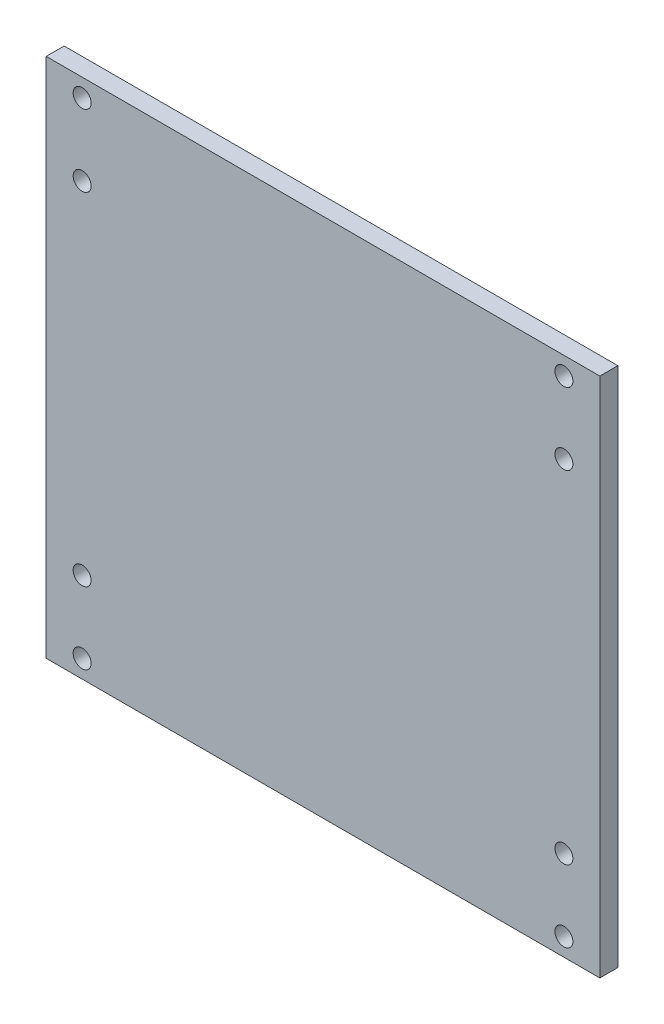
ISO-10303-21;
HEADER;
FILE_DESCRIPTION(('STEP AP214'),'2;1');
FILE_NAME('part.step','',(''),(''),'','','');
FILE_SCHEMA(('AUTOMOTIVE_DESIGN { 1 0 10303 214 1 1 1 1 }'));
ENDSEC;
DATA;
#1=APPLICATION_CONTEXT('core data for automotive mechanical design processes');
#2=APPLICATION_PROTOCOL_DEFINITION('international standard','automotive_design',2000,#1);
#3=PRODUCT_CONTEXT('',#1,'mechanical');
#4=PRODUCT('Part','Part','',(#3));
#5=PRODUCT_RELATED_PRODUCT_CATEGORY('part','',(#4));
#6=PRODUCT_DEFINITION_FORMATION('','',#4);
#7=PRODUCT_DEFINITION_CONTEXT('part definition',#1,'design');
#8=PRODUCT_DEFINITION('design','',#6,#7);
#9=PRODUCT_DEFINITION_SHAPE('','',#8);
#10=(LENGTH_UNIT() NAMED_UNIT(*) SI_UNIT(.MILLI.,.METRE.));
#11=(NAMED_UNIT(*) PLANE_ANGLE_UNIT() SI_UNIT($,.RADIAN.));
#12=(NAMED_UNIT(*) SI_UNIT($,.STERADIAN.) SOLID_ANGLE_UNIT());
#13=UNCERTAINTY_MEASURE_WITH_UNIT(LENGTH_MEASURE(1.E-05),#10,'distance_accuracy_value','');
#14=(GEOMETRIC_REPRESENTATION_CONTEXT(3) GLOBAL_UNCERTAINTY_ASSIGNED_CONTEXT((#13)) GLOBAL_UNIT_ASSIGNED_CONTEXT((#10,
#11,#12)) REPRESENTATION_CONTEXT('',''));
#15=CARTESIAN_POINT('',(0.,0.,0.));
#16=DIRECTION('',(0.,0.,1.));
#17=DIRECTION('',(1.,0.,0.));
#18=AXIS2_PLACEMENT_3D('',#15,#16,#17);
#19=CARTESIAN_POINT('',(0.,0.,2.));
#20=DIRECTION('',(0.,0.,1.));
#21=DIRECTION('',(1.,0.,0.));
#22=AXIS2_PLACEMENT_3D('',#19,#20,#21);
#23=PLANE('',#22);
#24=CARTESIAN_POINT('',(-31.307156780841,-19.4360902255639,2.));
#25=DIRECTION('',(0.,0.,1.));
#26=DIRECTION('',(-1.,0.,0.));
#27=AXIS2_PLACEMENT_3D('',#24,#25,#26);
#28=CIRCLE('',#27,0.999999999999998);
#29=CARTESIAN_POINT('',(-32.307156780841,-19.4360902255639,2.));
#30=VERTEX_POINT('',#29);
#31=EDGE_CURVE('E145',#30,#30,#28,.T.);
#32=ORIENTED_EDGE('',*,*,#31,.F.);
#33=EDGE_LOOP('',(#32));
#34=FACE_BOUND('',#33,.T.);
#35=CARTESIAN_POINT('',(22.292843219159,-27.4360902255639,2.));
#36=DIRECTION('',(0.,0.,1.));
#37=DIRECTION('',(1.,0.,0.));
#38=AXIS2_PLACEMENT_3D('',#35,#36,#37);
#39=CIRCLE('',#38,0.999999999999998);
#40=CARTESIAN_POINT('',(23.292843219159,-27.4360902255639,2.));
#41=VERTEX_POINT('',#40);
#42=EDGE_CURVE('E133',#41,#41,#39,.T.);
#43=ORIENTED_EDGE('',*,*,#42,.F.);
#44=EDGE_LOOP('',(#43));
#45=FACE_BOUND('',#44,.T.);
#46=CARTESIAN_POINT('',(22.292843219159,18.5639097744361,2.));
#47=DIRECTION('',(0.,0.,1.));
#48=DIRECTION('',(-1.,0.,0.));
#49=AXIS2_PLACEMENT_3D('',#46,#47,#48);
#50=CIRCLE('',#49,0.999999999999998);
#51=CARTESIAN_POINT('',(21.292843219159,18.5639097744361,2.));
#52=VERTEX_POINT('',#51);
#53=EDGE_CURVE('E121',#52,#52,#50,.T.);
#54=ORIENTED_EDGE('',*,*,#53,.F.);
#55=EDGE_LOOP('',(#54));
#56=FACE_BOUND('',#55,.T.);
#57=CARTESIAN_POINT('',(-31.307156780841,26.5639097744361,2.));
#58=DIRECTION('',(0.,0.,1.));
#59=DIRECTION('',(1.,0.,0.));
#60=AXIS2_PLACEMENT_3D('',#57,#58,#59);
#61=CIRCLE('',#60,0.999999999999998);
#62=CARTESIAN_POINT('',(-30.307156780841,26.5639097744361,2.));
#63=VERTEX_POINT('',#62);
#64=EDGE_CURVE('E100',#63,#63,#61,.T.);
#65=ORIENTED_EDGE('',*,*,#64,.F.);
#66=EDGE_LOOP('',(#65));
#67=FACE_BOUND('',#66,.T.);
#68=DIRECTION('',(0.,-1.,0.));
#69=VECTOR('',#68,1.);
#70=CARTESIAN_POINT('',(-35.307156780841,28.5639097744361,2.));
#71=LINE('',#70,#69);
#72=CARTESIAN_POINT('',(-35.307156780841,28.5639097744361,2.));
#73=VERTEX_POINT('',#72);
#74=CARTESIAN_POINT('',(-35.307156780841,-29.4360902255639,2.));
#75=VERTEX_POINT('',#74);
#76=EDGE_CURVE('E85',#73,#75,#71,.T.);
#77=ORIENTED_EDGE('',*,*,#76,.T.);
#78=DIRECTION('',(1.,0.,0.));
#79=VECTOR('',#78,1.);
#80=CARTESIAN_POINT('',(-35.307156780841,-29.4360902255639,2.));
#81=LINE('',#80,#79);
#82=CARTESIAN_POINT('',(26.292843219159,-29.4360902255639,2.));
#83=VERTEX_POINT('',#82);
#84=EDGE_CURVE('E80',#75,#83,#81,.T.);
#85=ORIENTED_EDGE('',*,*,#84,.T.);
#86=DIRECTION('',(0.,1.,0.));
#87=VECTOR('',#86,1.);
#88=CARTESIAN_POINT('',(26.292843219159,28.5639097744361,2.));
#89=LINE('',#88,#87);
#90=CARTESIAN_POINT('',(26.292843219159,28.5639097744361,2.));
#91=VERTEX_POINT('',#90);
#92=EDGE_CURVE('E83',#83,#91,#89,.T.);
#93=ORIENTED_EDGE('',*,*,#92,.T.);
#94=DIRECTION('',(-1.,0.,0.));
#95=VECTOR('',#94,1.);
#96=CARTESIAN_POINT('',(-35.307156780841,28.5639097744361,2.));
#97=LINE('',#96,#95);
#98=EDGE_CURVE('E50',#91,#73,#97,.T.);
#99=ORIENTED_EDGE('',*,*,#98,.T.);
#100=EDGE_LOOP('',(#77,#85,#93,#99));
#101=FACE_BOUND('',#100,.T.);
#102=CARTESIAN_POINT('',(-31.307156780841,18.5639097744361,2.));
#103=DIRECTION('',(0.,0.,1.));
#104=DIRECTION('',(1.,0.,0.));
#105=AXIS2_PLACEMENT_3D('',#102,#103,#104);
#106=CIRCLE('',#105,0.999999999999998);
#107=CARTESIAN_POINT('',(-30.307156780841,18.5639097744361,2.));
#108=VERTEX_POINT('',#107);
#109=EDGE_CURVE('E115',#108,#108,#106,.T.);
#110=ORIENTED_EDGE('',*,*,#109,.F.);
#111=EDGE_LOOP('',(#110));
#112=FACE_BOUND('',#111,.T.);
#113=CARTESIAN_POINT('',(22.292843219159,26.5639097744361,2.));
#114=DIRECTION('',(0.,0.,1.));
#115=DIRECTION('',(-1.,0.,0.));
#116=AXIS2_PLACEMENT_3D('',#113,#114,#115);
#117=CIRCLE('',#116,0.999999999999998);
#118=CARTESIAN_POINT('',(21.292843219159,26.5639097744361,2.));
#119=VERTEX_POINT('',#118);
#120=EDGE_CURVE('E127',#119,#119,#117,.T.);
#121=ORIENTED_EDGE('',*,*,#120,.F.);
#122=EDGE_LOOP('',(#121));
#123=FACE_BOUND('',#122,.T.);
#124=CARTESIAN_POINT('',(22.292843219159,-19.4360902255639,2.));
#125=DIRECTION('',(0.,0.,1.));
#126=DIRECTION('',(1.,0.,0.));
#127=AXIS2_PLACEMENT_3D('',#124,#125,#126);
#128=CIRCLE('',#127,0.999999999999998);
#129=CARTESIAN_POINT('',(23.292843219159,-19.4360902255639,2.));
#130=VERTEX_POINT('',#129);
#131=EDGE_CURVE('E139',#130,#130,#128,.T.);
#132=ORIENTED_EDGE('',*,*,#131,.F.);
#133=EDGE_LOOP('',(#132));
#134=FACE_BOUND('',#133,.T.);
#135=CARTESIAN_POINT('',(-31.307156780841,-27.4360902255639,2.));
#136=DIRECTION('',(0.,0.,1.));
#137=DIRECTION('',(-1.,0.,0.));
#138=AXIS2_PLACEMENT_3D('',#135,#136,#137);
#139=CIRCLE('',#138,0.999999999999998);
#140=CARTESIAN_POINT('',(-32.307156780841,-27.4360902255639,2.));
#141=VERTEX_POINT('',#140);
#142=EDGE_CURVE('E151',#141,#141,#139,.T.);
#143=ORIENTED_EDGE('',*,*,#142,.F.);
#144=EDGE_LOOP('',(#143));
#145=FACE_BOUND('',#144,.T.);
#146=ADVANCED_FACE('F33',(#34,#45,#56,#67,#101,#112,#123,#134,#145),#23,.T.);
#147=CARTESIAN_POINT('',(0.,0.,0.));
#148=DIRECTION('',(0.,0.,1.));
#149=DIRECTION('',(1.,0.,0.));
#150=AXIS2_PLACEMENT_3D('',#147,#148,#149);
#151=PLANE('',#150);
#152=DIRECTION('',(0.,-1.,0.));
#153=VECTOR('',#152,1.);
#154=CARTESIAN_POINT('',(-35.307156780841,28.5639097744361,0.));
#155=LINE('',#154,#153);
#156=CARTESIAN_POINT('',(-35.307156780841,28.5639097744361,0.));
#157=VERTEX_POINT('',#156);
#158=CARTESIAN_POINT('',(-35.307156780841,-29.4360902255639,0.));
#159=VERTEX_POINT('',#158);
#160=EDGE_CURVE('E97',#157,#159,#155,.T.);
#161=ORIENTED_EDGE('',*,*,#160,.F.);
#162=DIRECTION('',(-1.,0.,0.));
#163=VECTOR('',#162,1.);
#164=CARTESIAN_POINT('',(-35.307156780841,28.5639097744361,0.));
#165=LINE('',#164,#163);
#166=CARTESIAN_POINT('',(26.292843219159,28.5639097744361,0.));
#167=VERTEX_POINT('',#166);
#168=EDGE_CURVE('E73',#167,#157,#165,.T.);
#169=ORIENTED_EDGE('',*,*,#168,.F.);
#170=DIRECTION('',(0.,1.,0.));
#171=VECTOR('',#170,1.);
#172=CARTESIAN_POINT('',(26.292843219159,28.5639097744361,0.));
#173=LINE('',#172,#171);
#174=CARTESIAN_POINT('',(26.292843219159,-29.4360902255639,0.));
#175=VERTEX_POINT('',#174);
#176=EDGE_CURVE('E67',#175,#167,#173,.T.);
#177=ORIENTED_EDGE('',*,*,#176,.F.);
#178=DIRECTION('',(1.,0.,0.));
#179=VECTOR('',#178,1.);
#180=CARTESIAN_POINT('',(-35.307156780841,-29.4360902255639,0.));
#181=LINE('',#180,#179);
#182=EDGE_CURVE('E89',#159,#175,#181,.T.);
#183=ORIENTED_EDGE('',*,*,#182,.F.);
#184=EDGE_LOOP('',(#161,#169,#177,#183));
#185=FACE_BOUND('',#184,.T.);
#186=CARTESIAN_POINT('',(-31.307156780841,26.5639097744361,0.));
#187=DIRECTION('',(0.,0.,1.));
#188=DIRECTION('',(1.,0.,0.));
#189=AXIS2_PLACEMENT_3D('',#186,#187,#188);
#190=CIRCLE('',#189,0.999999999999998);
#191=CARTESIAN_POINT('',(-30.307156780841,26.5639097744361,0.));
#192=VERTEX_POINT('',#191);
#193=EDGE_CURVE('E112',#192,#192,#190,.T.);
#194=ORIENTED_EDGE('',*,*,#193,.T.);
#195=EDGE_LOOP('',(#194));
#196=FACE_BOUND('',#195,.T.);
#197=CARTESIAN_POINT('',(-31.307156780841,18.5639097744361,0.));
#198=DIRECTION('',(0.,0.,1.));
#199=DIRECTION('',(1.,0.,0.));
#200=AXIS2_PLACEMENT_3D('',#197,#198,#199);
#201=CIRCLE('',#200,0.999999999999998);
#202=CARTESIAN_POINT('',(-30.307156780841,18.5639097744361,0.));
#203=VERTEX_POINT('',#202);
#204=EDGE_CURVE('E118',#203,#203,#201,.T.);
#205=ORIENTED_EDGE('',*,*,#204,.T.);
#206=EDGE_LOOP('',(#205));
#207=FACE_BOUND('',#206,.T.);
#208=CARTESIAN_POINT('',(22.292843219159,18.5639097744361,0.));
#209=DIRECTION('',(0.,0.,1.));
#210=DIRECTION('',(-1.,0.,0.));
#211=AXIS2_PLACEMENT_3D('',#208,#209,#210);
#212=CIRCLE('',#211,0.999999999999998);
#213=CARTESIAN_POINT('',(21.292843219159,18.5639097744361,0.));
#214=VERTEX_POINT('',#213);
#215=EDGE_CURVE('E124',#214,#214,#212,.T.);
#216=ORIENTED_EDGE('',*,*,#215,.T.);
#217=EDGE_LOOP('',(#216));
#218=FACE_BOUND('',#217,.T.);
#219=CARTESIAN_POINT('',(22.292843219159,26.5639097744361,0.));
#220=DIRECTION('',(0.,0.,1.));
#221=DIRECTION('',(-1.,0.,0.));
#222=AXIS2_PLACEMENT_3D('',#219,#220,#221);
#223=CIRCLE('',#222,0.999999999999998);
#224=CARTESIAN_POINT('',(21.292843219159,26.5639097744361,0.));
#225=VERTEX_POINT('',#224);
#226=EDGE_CURVE('E130',#225,#225,#223,.T.);
#227=ORIENTED_EDGE('',*,*,#226,.T.);
#228=EDGE_LOOP('',(#227));
#229=FACE_BOUND('',#228,.T.);
#230=CARTESIAN_POINT('',(22.292843219159,-27.4360902255639,0.));
#231=DIRECTION('',(0.,0.,1.));
#232=DIRECTION('',(1.,0.,0.));
#233=AXIS2_PLACEMENT_3D('',#230,#231,#232);
#234=CIRCLE('',#233,0.999999999999998);
#235=CARTESIAN_POINT('',(23.292843219159,-27.4360902255639,0.));
#236=VERTEX_POINT('',#235);
#237=EDGE_CURVE('E136',#236,#236,#234,.T.);
#238=ORIENTED_EDGE('',*,*,#237,.T.);
#239=EDGE_LOOP('',(#238));
#240=FACE_BOUND('',#239,.T.);
#241=CARTESIAN_POINT('',(22.292843219159,-19.4360902255639,0.));
#242=DIRECTION('',(0.,0.,1.));
#243=DIRECTION('',(1.,0.,0.));
#244=AXIS2_PLACEMENT_3D('',#241,#242,#243);
#245=CIRCLE('',#244,0.999999999999998);
#246=CARTESIAN_POINT('',(23.292843219159,-19.4360902255639,0.));
#247=VERTEX_POINT('',#246);
#248=EDGE_CURVE('E142',#247,#247,#245,.T.);
#249=ORIENTED_EDGE('',*,*,#248,.T.);
#250=EDGE_LOOP('',(#249));
#251=FACE_BOUND('',#250,.T.);
#252=CARTESIAN_POINT('',(-31.307156780841,-19.4360902255639,0.));
#253=DIRECTION('',(0.,0.,1.));
#254=DIRECTION('',(-1.,0.,0.));
#255=AXIS2_PLACEMENT_3D('',#252,#253,#254);
#256=CIRCLE('',#255,0.999999999999998);
#257=CARTESIAN_POINT('',(-32.307156780841,-19.4360902255639,0.));
#258=VERTEX_POINT('',#257);
#259=EDGE_CURVE('E148',#258,#258,#256,.T.);
#260=ORIENTED_EDGE('',*,*,#259,.T.);
#261=EDGE_LOOP('',(#260));
#262=FACE_BOUND('',#261,.T.);
#263=CARTESIAN_POINT('',(-31.307156780841,-27.4360902255639,0.));
#264=DIRECTION('',(0.,0.,1.));
#265=DIRECTION('',(-1.,0.,0.));
#266=AXIS2_PLACEMENT_3D('',#263,#264,#265);
#267=CIRCLE('',#266,0.999999999999998);
#268=CARTESIAN_POINT('',(-32.307156780841,-27.4360902255639,0.));
#269=VERTEX_POINT('',#268);
#270=EDGE_CURVE('E154',#269,#269,#267,.T.);
#271=ORIENTED_EDGE('',*,*,#270,.T.);
#272=EDGE_LOOP('',(#271));
#273=FACE_BOUND('',#272,.T.);
#274=ADVANCED_FACE('F108',(#185,#196,#207,#218,#229,#240,#251,#262,#273),#151,.F.);
#275=CARTESIAN_POINT('',(-35.307156780841,28.5639097744361,2.));
#276=DIRECTION('',(1.,0.,0.));
#277=DIRECTION('',(0.,0.,-1.));
#278=AXIS2_PLACEMENT_3D('',#275,#276,#277);
#279=PLANE('',#278);
#280=ORIENTED_EDGE('',*,*,#160,.T.);
#281=DIRECTION('',(0.,0.,-1.));
#282=VECTOR('',#281,1.);
#283=CARTESIAN_POINT('',(-35.307156780841,-29.4360902255639,2.));
#284=LINE('',#283,#282);
#285=EDGE_CURVE('E11',#75,#159,#284,.T.);
#286=ORIENTED_EDGE('',*,*,#285,.F.);
#287=ORIENTED_EDGE('',*,*,#76,.F.);
#288=DIRECTION('',(0.,0.,-1.));
#289=VECTOR('',#288,1.);
#290=CARTESIAN_POINT('',(-35.307156780841,28.5639097744361,2.));
#291=LINE('',#290,#289);
#292=EDGE_CURVE('E93',#73,#157,#291,.T.);
#293=ORIENTED_EDGE('',*,*,#292,.T.);
#294=EDGE_LOOP('',(#280,#286,#287,#293));
#295=FACE_BOUND('',#294,.T.);
#296=ADVANCED_FACE('F35',(#295),#279,.F.);
#297=CARTESIAN_POINT('',(-35.307156780841,-29.4360902255639,2.));
#298=DIRECTION('',(0.,1.,0.));
#299=DIRECTION('',(-1.,0.,0.));
#300=AXIS2_PLACEMENT_3D('',#297,#298,#299);
#301=PLANE('',#300);
#302=ORIENTED_EDGE('',*,*,#182,.T.);
#303=DIRECTION('',(0.,0.,-1.));
#304=VECTOR('',#303,1.);
#305=CARTESIAN_POINT('',(26.292843219159,-29.4360902255639,2.));
#306=LINE('',#305,#304);
#307=EDGE_CURVE('E42',#83,#175,#306,.T.);
#308=ORIENTED_EDGE('',*,*,#307,.F.);
#309=ORIENTED_EDGE('',*,*,#84,.F.);
#310=ORIENTED_EDGE('',*,*,#285,.T.);
#311=EDGE_LOOP('',(#302,#308,#309,#310));
#312=FACE_BOUND('',#311,.T.);
#313=ADVANCED_FACE('F88',(#312),#301,.F.);
#314=CARTESIAN_POINT('',(26.292843219159,28.5639097744361,2.));
#315=DIRECTION('',(-1.,0.,0.));
#316=DIRECTION('',(0.,-1.,0.));
#317=AXIS2_PLACEMENT_3D('',#314,#315,#316);
#318=PLANE('',#317);
#319=ORIENTED_EDGE('',*,*,#176,.T.);
#320=DIRECTION('',(0.,0.,-1.));
#321=VECTOR('',#320,1.);
#322=CARTESIAN_POINT('',(26.292843219159,28.5639097744361,2.));
#323=LINE('',#322,#321);
#324=EDGE_CURVE('E90',#91,#167,#323,.T.);
#325=ORIENTED_EDGE('',*,*,#324,.F.);
#326=ORIENTED_EDGE('',*,*,#92,.F.);
#327=ORIENTED_EDGE('',*,*,#307,.T.);
#328=EDGE_LOOP('',(#319,#325,#326,#327));
#329=FACE_BOUND('',#328,.T.);
#330=ADVANCED_FACE('F91',(#329),#318,.F.);
#331=CARTESIAN_POINT('',(-35.307156780841,28.5639097744361,2.));
#332=DIRECTION('',(0.,-1.,0.));
#333=DIRECTION('',(0.,0.,-1.));
#334=AXIS2_PLACEMENT_3D('',#331,#332,#333);
#335=PLANE('',#334);
#336=ORIENTED_EDGE('',*,*,#168,.T.);
#337=ORIENTED_EDGE('',*,*,#292,.F.);
#338=ORIENTED_EDGE('',*,*,#98,.F.);
#339=ORIENTED_EDGE('',*,*,#324,.T.);
#340=EDGE_LOOP('',(#336,#337,#338,#339));
#341=FACE_BOUND('',#340,.T.);
#342=ADVANCED_FACE('F105',(#341),#335,.F.);
#343=CARTESIAN_POINT('',(-31.307156780841,26.5639097744361,2.));
#344=DIRECTION('',(0.,0.,-1.));
#345=DIRECTION('',(-1.,0.,0.));
#346=AXIS2_PLACEMENT_3D('',#343,#344,#345);
#347=CYLINDRICAL_SURFACE('',#346,0.999999999999998);
#348=ORIENTED_EDGE('',*,*,#64,.T.);
#349=EDGE_LOOP('',(#348));
#350=FACE_BOUND('',#349,.T.);
#351=ORIENTED_EDGE('',*,*,#193,.F.);
#352=EDGE_LOOP('',(#351));
#353=FACE_BOUND('',#352,.T.);
#354=ADVANCED_FACE('F173',(#350,#353),#347,.F.);
#355=CARTESIAN_POINT('',(-31.307156780841,18.5639097744361,2.));
#356=DIRECTION('',(0.,0.,-1.));
#357=DIRECTION('',(-1.,0.,0.));
#358=AXIS2_PLACEMENT_3D('',#355,#356,#357);
#359=CYLINDRICAL_SURFACE('',#358,0.999999999999998);
#360=ORIENTED_EDGE('',*,*,#109,.T.);
#361=EDGE_LOOP('',(#360));
#362=FACE_BOUND('',#361,.T.);
#363=ORIENTED_EDGE('',*,*,#204,.F.);
#364=EDGE_LOOP('',(#363));
#365=FACE_BOUND('',#364,.T.);
#366=ADVANCED_FACE('F219',(#362,#365),#359,.F.);
#367=CARTESIAN_POINT('',(22.292843219159,18.5639097744361,2.));
#368=DIRECTION('',(0.,0.,-1.));
#369=DIRECTION('',(-1.,0.,0.));
#370=AXIS2_PLACEMENT_3D('',#367,#368,#369);
#371=CYLINDRICAL_SURFACE('',#370,0.999999999999998);
#372=ORIENTED_EDGE('',*,*,#53,.T.);
#373=EDGE_LOOP('',(#372));
#374=FACE_BOUND('',#373,.T.);
#375=ORIENTED_EDGE('',*,*,#215,.F.);
#376=EDGE_LOOP('',(#375));
#377=FACE_BOUND('',#376,.T.);
#378=ADVANCED_FACE('F227',(#374,#377),#371,.F.);
#379=CARTESIAN_POINT('',(22.292843219159,26.5639097744361,2.));
#380=DIRECTION('',(0.,0.,-1.));
#381=DIRECTION('',(-1.,0.,0.));
#382=AXIS2_PLACEMENT_3D('',#379,#380,#381);
#383=CYLINDRICAL_SURFACE('',#382,0.999999999999998);
#384=ORIENTED_EDGE('',*,*,#120,.T.);
#385=EDGE_LOOP('',(#384));
#386=FACE_BOUND('',#385,.T.);
#387=ORIENTED_EDGE('',*,*,#226,.F.);
#388=EDGE_LOOP('',(#387));
#389=FACE_BOUND('',#388,.T.);
#390=ADVANCED_FACE('F235',(#386,#389),#383,.F.);
#391=CARTESIAN_POINT('',(22.292843219159,-27.4360902255639,2.));
#392=DIRECTION('',(0.,0.,-1.));
#393=DIRECTION('',(-1.,0.,0.));
#394=AXIS2_PLACEMENT_3D('',#391,#392,#393);
#395=CYLINDRICAL_SURFACE('',#394,0.999999999999998);
#396=ORIENTED_EDGE('',*,*,#42,.T.);
#397=EDGE_LOOP('',(#396));
#398=FACE_BOUND('',#397,.T.);
#399=ORIENTED_EDGE('',*,*,#237,.F.);
#400=EDGE_LOOP('',(#399));
#401=FACE_BOUND('',#400,.T.);
#402=ADVANCED_FACE('F244',(#398,#401),#395,.F.);
#403=CARTESIAN_POINT('',(22.292843219159,-19.4360902255639,2.));
#404=DIRECTION('',(0.,0.,-1.));
#405=DIRECTION('',(-1.,0.,0.));
#406=AXIS2_PLACEMENT_3D('',#403,#404,#405);
#407=CYLINDRICAL_SURFACE('',#406,0.999999999999998);
#408=ORIENTED_EDGE('',*,*,#131,.T.);
#409=EDGE_LOOP('',(#408));
#410=FACE_BOUND('',#409,.T.);
#411=ORIENTED_EDGE('',*,*,#248,.F.);
#412=EDGE_LOOP('',(#411));
#413=FACE_BOUND('',#412,.T.);
#414=ADVANCED_FACE('F253',(#410,#413),#407,.F.);
#415=CARTESIAN_POINT('',(-31.307156780841,-19.4360902255639,2.));
#416=DIRECTION('',(0.,0.,-1.));
#417=DIRECTION('',(-1.,0.,0.));
#418=AXIS2_PLACEMENT_3D('',#415,#416,#417);
#419=CYLINDRICAL_SURFACE('',#418,0.999999999999998);
#420=ORIENTED_EDGE('',*,*,#31,.T.);
#421=EDGE_LOOP('',(#420));
#422=FACE_BOUND('',#421,.T.);
#423=ORIENTED_EDGE('',*,*,#259,.F.);
#424=EDGE_LOOP('',(#423));
#425=FACE_BOUND('',#424,.T.);
#426=ADVANCED_FACE('F262',(#422,#425),#419,.F.);
#427=CARTESIAN_POINT('',(-31.307156780841,-27.4360902255639,2.));
#428=DIRECTION('',(0.,0.,-1.));
#429=DIRECTION('',(-1.,0.,0.));
#430=AXIS2_PLACEMENT_3D('',#427,#428,#429);
#431=CYLINDRICAL_SURFACE('',#430,0.999999999999998);
#432=ORIENTED_EDGE('',*,*,#142,.T.);
#433=EDGE_LOOP('',(#432));
#434=FACE_BOUND('',#433,.T.);
#435=ORIENTED_EDGE('',*,*,#270,.F.);
#436=EDGE_LOOP('',(#435));
#437=FACE_BOUND('',#436,.T.);
#438=ADVANCED_FACE('F160',(#434,#437),#431,.F.);
#439=CLOSED_SHELL('',(#146,#274,#296,#313,#330,#342,#354,#366,#378,#390,#402,#414,#426,#438));
#440=MANIFOLD_SOLID_BREP('B2',#439);
#441=ADVANCED_BREP_SHAPE_REPRESENTATION('',(#18,#440),#14);
#442=SHAPE_DEFINITION_REPRESENTATION(#9,#441);
ENDSEC;
END-ISO-10303-21;
